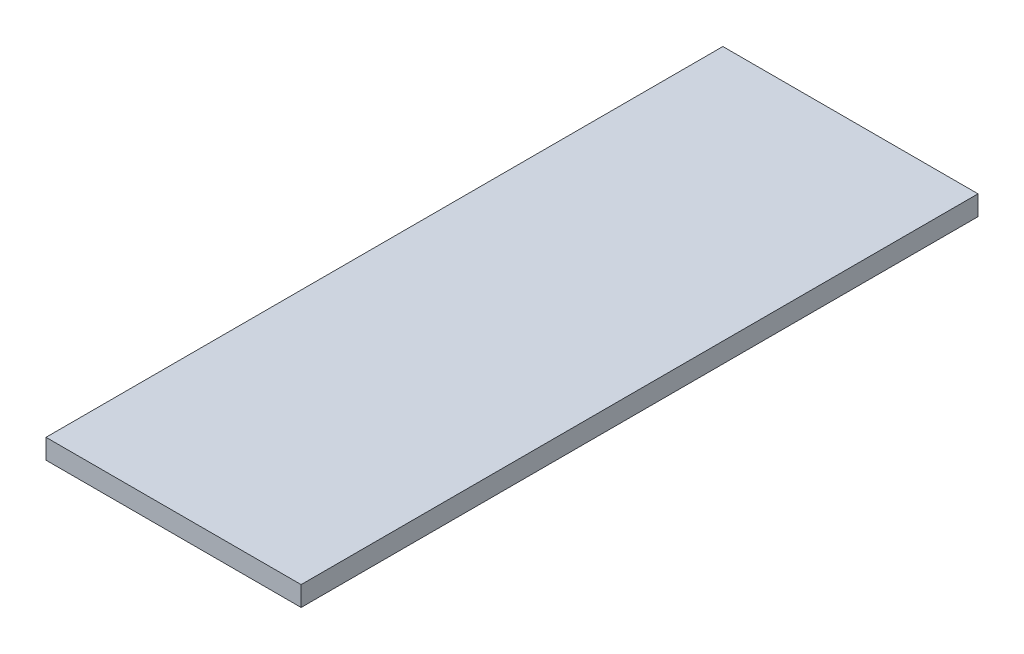
ISO-10303-21;
HEADER;
FILE_DESCRIPTION(('STEP AP214'),'2;1');
FILE_NAME('part.step','',(''),(''),'','','');
FILE_SCHEMA(('AUTOMOTIVE_DESIGN { 1 0 10303 214 1 1 1 1 }'));
ENDSEC;
DATA;
#1=APPLICATION_CONTEXT('core data for automotive mechanical design processes');
#2=APPLICATION_PROTOCOL_DEFINITION('international standard','automotive_design',2000,#1);
#3=PRODUCT_CONTEXT('',#1,'mechanical');
#4=PRODUCT('Part','Part','',(#3));
#5=PRODUCT_RELATED_PRODUCT_CATEGORY('part','',(#4));
#6=PRODUCT_DEFINITION_FORMATION('','',#4);
#7=PRODUCT_DEFINITION_CONTEXT('part definition',#1,'design');
#8=PRODUCT_DEFINITION('design','',#6,#7);
#9=PRODUCT_DEFINITION_SHAPE('','',#8);
#10=(LENGTH_UNIT() NAMED_UNIT(*) SI_UNIT(.MILLI.,.METRE.));
#11=(NAMED_UNIT(*) PLANE_ANGLE_UNIT() SI_UNIT($,.RADIAN.));
#12=(NAMED_UNIT(*) SI_UNIT($,.STERADIAN.) SOLID_ANGLE_UNIT());
#13=UNCERTAINTY_MEASURE_WITH_UNIT(LENGTH_MEASURE(1.E-05),#10,'distance_accuracy_value','');
#14=(GEOMETRIC_REPRESENTATION_CONTEXT(3) GLOBAL_UNCERTAINTY_ASSIGNED_CONTEXT((#13)) GLOBAL_UNIT_ASSIGNED_CONTEXT((#10,
#11,#12)) REPRESENTATION_CONTEXT('',''));
#15=CARTESIAN_POINT('',(0.,0.,0.));
#16=DIRECTION('',(0.,0.,1.));
#17=DIRECTION('',(1.,0.,0.));
#18=AXIS2_PLACEMENT_3D('',#15,#16,#17);
#19=CARTESIAN_POINT('',(122.5,19.05,-325.));
#20=DIRECTION('',(-1.,0.,0.));
#21=DIRECTION('',(0.,0.,1.));
#22=AXIS2_PLACEMENT_3D('',#19,#20,#21);
#23=PLANE('',#22);
#24=DIRECTION('',(0.,0.,-1.));
#25=VECTOR('',#24,1.);
#26=CARTESIAN_POINT('',(122.5,0.,-325.));
#27=LINE('',#26,#25);
#28=CARTESIAN_POINT('',(122.5,0.,325.));
#29=VERTEX_POINT('',#28);
#30=CARTESIAN_POINT('',(122.5,0.,-325.));
#31=VERTEX_POINT('',#30);
#32=EDGE_CURVE('E96',#29,#31,#27,.T.);
#33=ORIENTED_EDGE('',*,*,#32,.T.);
#34=DIRECTION('',(0.,-1.,0.));
#35=VECTOR('',#34,1.);
#36=CARTESIAN_POINT('',(122.5,19.05,-325.));
#37=LINE('',#36,#35);
#38=CARTESIAN_POINT('',(122.5,19.05,-325.));
#39=VERTEX_POINT('',#38);
#40=EDGE_CURVE('E11',#39,#31,#37,.T.);
#41=ORIENTED_EDGE('',*,*,#40,.F.);
#42=DIRECTION('',(0.,0.,-1.));
#43=VECTOR('',#42,1.);
#44=CARTESIAN_POINT('',(122.5,19.05,-325.));
#45=LINE('',#44,#43);
#46=CARTESIAN_POINT('',(122.5,19.05,325.));
#47=VERTEX_POINT('',#46);
#48=EDGE_CURVE('E84',#47,#39,#45,.T.);
#49=ORIENTED_EDGE('',*,*,#48,.F.);
#50=DIRECTION('',(0.,-1.,0.));
#51=VECTOR('',#50,1.);
#52=CARTESIAN_POINT('',(122.5,19.05,325.));
#53=LINE('',#52,#51);
#54=EDGE_CURVE('E92',#47,#29,#53,.T.);
#55=ORIENTED_EDGE('',*,*,#54,.T.);
#56=EDGE_LOOP('',(#33,#41,#49,#55));
#57=FACE_BOUND('',#56,.T.);
#58=ADVANCED_FACE('F33',(#57),#23,.F.);
#59=CARTESIAN_POINT('',(-122.5,19.05,-325.));
#60=DIRECTION('',(0.,0.,1.));
#61=DIRECTION('',(1.,0.,0.));
#62=AXIS2_PLACEMENT_3D('',#59,#60,#61);
#63=PLANE('',#62);
#64=DIRECTION('',(-1.,0.,0.));
#65=VECTOR('',#64,1.);
#66=CARTESIAN_POINT('',(-122.5,0.,-325.));
#67=LINE('',#66,#65);
#68=CARTESIAN_POINT('',(-122.5,0.,-325.));
#69=VERTEX_POINT('',#68);
#70=EDGE_CURVE('E88',#31,#69,#67,.T.);
#71=ORIENTED_EDGE('',*,*,#70,.T.);
#72=DIRECTION('',(0.,-1.,0.));
#73=VECTOR('',#72,1.);
#74=CARTESIAN_POINT('',(-122.5,19.05,-325.));
#75=LINE('',#74,#73);
#76=CARTESIAN_POINT('',(-122.5,19.05,-325.));
#77=VERTEX_POINT('',#76);
#78=EDGE_CURVE('E41',#77,#69,#75,.T.);
#79=ORIENTED_EDGE('',*,*,#78,.F.);
#80=DIRECTION('',(-1.,0.,0.));
#81=VECTOR('',#80,1.);
#82=CARTESIAN_POINT('',(-122.5,19.05,-325.));
#83=LINE('',#82,#81);
#84=EDGE_CURVE('E79',#39,#77,#83,.T.);
#85=ORIENTED_EDGE('',*,*,#84,.F.);
#86=ORIENTED_EDGE('',*,*,#40,.T.);
#87=EDGE_LOOP('',(#71,#79,#85,#86));
#88=FACE_BOUND('',#87,.T.);
#89=ADVANCED_FACE('F87',(#88),#63,.F.);
#90=CARTESIAN_POINT('',(-122.5,19.05,-325.));
#91=DIRECTION('',(1.,0.,0.));
#92=DIRECTION('',(0.,0.,-1.));
#93=AXIS2_PLACEMENT_3D('',#90,#91,#92);
#94=PLANE('',#93);
#95=DIRECTION('',(0.,0.,1.));
#96=VECTOR('',#95,1.);
#97=CARTESIAN_POINT('',(-122.5,0.,-325.));
#98=LINE('',#97,#96);
#99=CARTESIAN_POINT('',(-122.5,0.,325.));
#100=VERTEX_POINT('',#99);
#101=EDGE_CURVE('E66',#69,#100,#98,.T.);
#102=ORIENTED_EDGE('',*,*,#101,.T.);
#103=DIRECTION('',(0.,-1.,0.));
#104=VECTOR('',#103,1.);
#105=CARTESIAN_POINT('',(-122.5,19.05,325.));
#106=LINE('',#105,#104);
#107=CARTESIAN_POINT('',(-122.5,19.05,325.));
#108=VERTEX_POINT('',#107);
#109=EDGE_CURVE('E89',#108,#100,#106,.T.);
#110=ORIENTED_EDGE('',*,*,#109,.F.);
#111=DIRECTION('',(0.,0.,1.));
#112=VECTOR('',#111,1.);
#113=CARTESIAN_POINT('',(-122.5,19.05,-325.));
#114=LINE('',#113,#112);
#115=EDGE_CURVE('E82',#77,#108,#114,.T.);
#116=ORIENTED_EDGE('',*,*,#115,.F.);
#117=ORIENTED_EDGE('',*,*,#78,.T.);
#118=EDGE_LOOP('',(#102,#110,#116,#117));
#119=FACE_BOUND('',#118,.T.);
#120=ADVANCED_FACE('F90',(#119),#94,.F.);
#121=CARTESIAN_POINT('',(-122.5,19.05,325.));
#122=DIRECTION('',(0.,0.,-1.));
#123=DIRECTION('',(-1.,0.,0.));
#124=AXIS2_PLACEMENT_3D('',#121,#122,#123);
#125=PLANE('',#124);
#126=DIRECTION('',(1.,0.,0.));
#127=VECTOR('',#126,1.);
#128=CARTESIAN_POINT('',(-122.5,0.,325.));
#129=LINE('',#128,#127);
#130=EDGE_CURVE('E72',#100,#29,#129,.T.);
#131=ORIENTED_EDGE('',*,*,#130,.T.);
#132=ORIENTED_EDGE('',*,*,#54,.F.);
#133=DIRECTION('',(1.,0.,0.));
#134=VECTOR('',#133,1.);
#135=CARTESIAN_POINT('',(-122.5,19.05,325.));
#136=LINE('',#135,#134);
#137=EDGE_CURVE('E49',#108,#47,#136,.T.);
#138=ORIENTED_EDGE('',*,*,#137,.F.);
#139=ORIENTED_EDGE('',*,*,#109,.T.);
#140=EDGE_LOOP('',(#131,#132,#138,#139));
#141=FACE_BOUND('',#140,.T.);
#142=ADVANCED_FACE('F103',(#141),#125,.F.);
#143=CARTESIAN_POINT('',(0.,19.05,0.));
#144=DIRECTION('',(0.,1.,0.));
#145=DIRECTION('',(0.,0.,1.));
#146=AXIS2_PLACEMENT_3D('',#143,#144,#145);
#147=PLANE('',#146);
#148=ORIENTED_EDGE('',*,*,#48,.T.);
#149=ORIENTED_EDGE('',*,*,#84,.T.);
#150=ORIENTED_EDGE('',*,*,#115,.T.);
#151=ORIENTED_EDGE('',*,*,#137,.T.);
#152=EDGE_LOOP('',(#148,#149,#150,#151));
#153=FACE_BOUND('',#152,.T.);
#154=ADVANCED_FACE('F80',(#153),#147,.T.);
#155=CARTESIAN_POINT('',(0.,0.,0.));
#156=DIRECTION('',(0.,1.,0.));
#157=DIRECTION('',(0.,0.,1.));
#158=AXIS2_PLACEMENT_3D('',#155,#156,#157);
#159=PLANE('',#158);
#160=ORIENTED_EDGE('',*,*,#32,.F.);
#161=ORIENTED_EDGE('',*,*,#130,.F.);
#162=ORIENTED_EDGE('',*,*,#101,.F.);
#163=ORIENTED_EDGE('',*,*,#70,.F.);
#164=EDGE_LOOP('',(#160,#161,#162,#163));
#165=FACE_BOUND('',#164,.T.);
#166=ADVANCED_FACE('F106',(#165),#159,.F.);
#167=CLOSED_SHELL('',(#58,#89,#120,#142,#154,#166));
#168=MANIFOLD_SOLID_BREP('B2',#167);
#169=ADVANCED_BREP_SHAPE_REPRESENTATION('',(#18,#168),#14);
#170=SHAPE_DEFINITION_REPRESENTATION(#9,#169);
ENDSEC;
END-ISO-10303-21;
